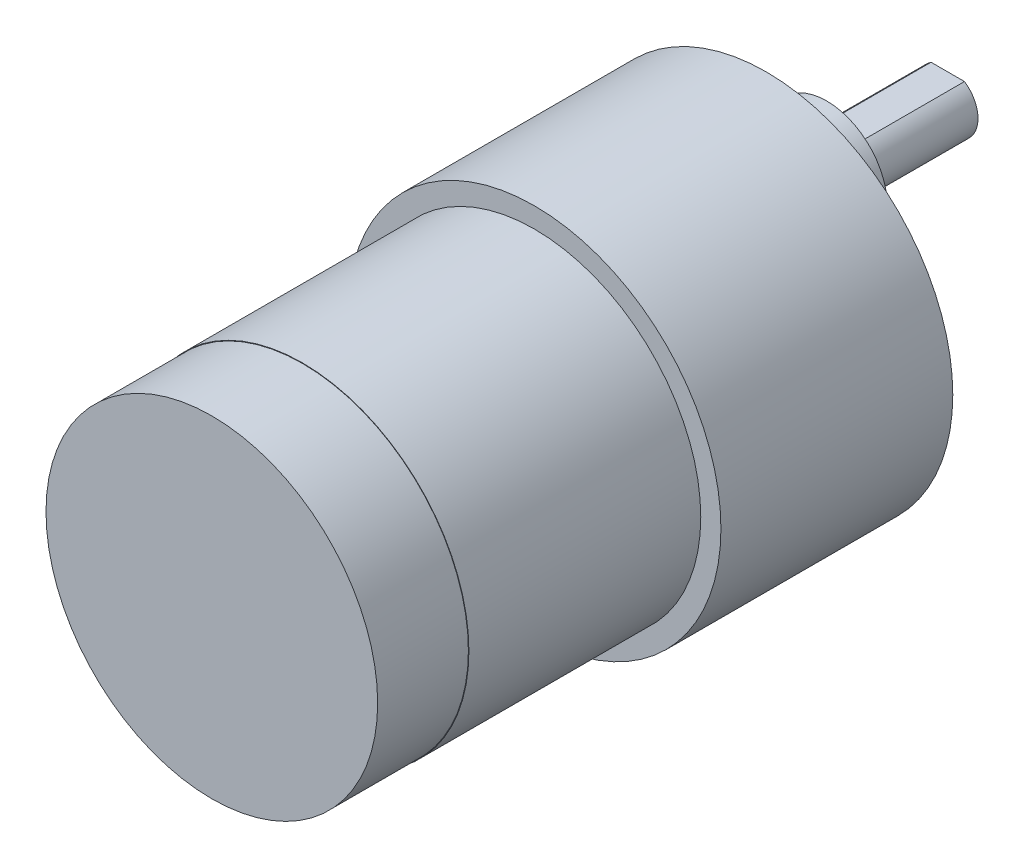
ISO-10303-21;
HEADER;
FILE_DESCRIPTION(('STEP AP214'),'2;1');
FILE_NAME('part.step','',(''),(''),'','','');
FILE_SCHEMA(('AUTOMOTIVE_DESIGN { 1 0 10303 214 1 1 1 1 }'));
ENDSEC;
DATA;
#1=APPLICATION_CONTEXT('core data for automotive mechanical design processes');
#2=APPLICATION_PROTOCOL_DEFINITION('international standard','automotive_design',2000,#1);
#3=PRODUCT_CONTEXT('',#1,'mechanical');
#4=PRODUCT('Part','Part','',(#3));
#5=PRODUCT_RELATED_PRODUCT_CATEGORY('part','',(#4));
#6=PRODUCT_DEFINITION_FORMATION('','',#4);
#7=PRODUCT_DEFINITION_CONTEXT('part definition',#1,'design');
#8=PRODUCT_DEFINITION('design','',#6,#7);
#9=PRODUCT_DEFINITION_SHAPE('','',#8);
#10=(LENGTH_UNIT() NAMED_UNIT(*) SI_UNIT(.MILLI.,.METRE.));
#11=(NAMED_UNIT(*) PLANE_ANGLE_UNIT() SI_UNIT($,.RADIAN.));
#12=(NAMED_UNIT(*) SI_UNIT($,.STERADIAN.) SOLID_ANGLE_UNIT());
#13=UNCERTAINTY_MEASURE_WITH_UNIT(LENGTH_MEASURE(1.E-05),#10,'distance_accuracy_value','');
#14=(GEOMETRIC_REPRESENTATION_CONTEXT(3) GLOBAL_UNCERTAINTY_ASSIGNED_CONTEXT((#13)) GLOBAL_UNIT_ASSIGNED_CONTEXT((#10,
#11,#12)) REPRESENTATION_CONTEXT('',''));
#15=CARTESIAN_POINT('',(0.,0.,0.));
#16=DIRECTION('',(0.,0.,1.));
#17=DIRECTION('',(1.,0.,0.));
#18=AXIS2_PLACEMENT_3D('',#15,#16,#17);
#19=CARTESIAN_POINT('',(0.,7.,-18.));
#20=DIRECTION('',(0.,0.,1.));
#21=DIRECTION('',(1.,0.,0.));
#22=AXIS2_PLACEMENT_3D('',#19,#20,#21);
#23=CYLINDRICAL_SURFACE('',#22,3.);
#24=CARTESIAN_POINT('',(0.,7.,-6.));
#25=DIRECTION('',(0.,0.,-1.));
#26=DIRECTION('',(-1.,0.,0.));
#27=AXIS2_PLACEMENT_3D('',#24,#25,#26);
#28=CIRCLE('',#27,3.);
#29=CARTESIAN_POINT('',(-3.,7.,-6.));
#30=VERTEX_POINT('',#29);
#31=EDGE_CURVE('E148',#30,#30,#28,.T.);
#32=ORIENTED_EDGE('',*,*,#31,.T.);
#33=EDGE_LOOP('',(#32));
#34=FACE_BOUND('',#33,.T.);
#35=DIRECTION('',(0.,0.,1.));
#36=VECTOR('',#35,1.);
#37=CARTESIAN_POINT('',(-1.6583123951777,9.5,-18.));
#38=LINE('',#37,#36);
#39=CARTESIAN_POINT('',(-1.6583123951777,9.5,-18.));
#40=VERTEX_POINT('',#39);
#41=CARTESIAN_POINT('',(-1.6583123951777,9.5,-6.5));
#42=VERTEX_POINT('',#41);
#43=EDGE_CURVE('E142',#40,#42,#38,.T.);
#44=ORIENTED_EDGE('',*,*,#43,.F.);
#45=CARTESIAN_POINT('',(0.,7.,-18.));
#46=DIRECTION('',(0.,0.,-1.));
#47=DIRECTION('',(-1.,0.,0.));
#48=AXIS2_PLACEMENT_3D('',#45,#46,#47);
#49=CIRCLE('',#48,3.);
#50=CARTESIAN_POINT('',(1.6583123951777,9.5,-18.));
#51=VERTEX_POINT('',#50);
#52=EDGE_CURVE('E144',#51,#40,#49,.T.);
#53=ORIENTED_EDGE('',*,*,#52,.F.);
#54=DIRECTION('',(0.,0.,1.));
#55=VECTOR('',#54,1.);
#56=CARTESIAN_POINT('',(1.6583123951777,9.5,-18.));
#57=LINE('',#56,#55);
#58=CARTESIAN_POINT('',(1.6583123951777,9.5,-6.5));
#59=VERTEX_POINT('',#58);
#60=EDGE_CURVE('E63',#59,#51,#57,.F.);
#61=ORIENTED_EDGE('',*,*,#60,.F.);
#62=CARTESIAN_POINT('',(0.,7.,-6.5));
#63=DIRECTION('',(0.,0.,-1.));
#64=DIRECTION('',(-1.,0.,0.));
#65=AXIS2_PLACEMENT_3D('',#62,#63,#64);
#66=CIRCLE('',#65,3.);
#67=EDGE_CURVE('E51',#42,#59,#66,.T.);
#68=ORIENTED_EDGE('',*,*,#67,.F.);
#69=EDGE_LOOP('',(#44,#53,#61,#68));
#70=FACE_BOUND('',#69,.T.);
#71=ADVANCED_FACE('F47',(#34,#70),#23,.T.);
#72=CARTESIAN_POINT('',(0.,7.,-18.));
#73=DIRECTION('',(0.,0.,-1.));
#74=DIRECTION('',(-1.,0.,0.));
#75=AXIS2_PLACEMENT_3D('',#72,#73,#74);
#76=PLANE('',#75);
#77=ORIENTED_EDGE('',*,*,#52,.T.);
#78=DIRECTION('',(1.,0.,0.));
#79=VECTOR('',#78,1.);
#80=CARTESIAN_POINT('',(0.,9.5,-18.));
#81=LINE('',#80,#79);
#82=EDGE_CURVE('E151',#40,#51,#81,.T.);
#83=ORIENTED_EDGE('',*,*,#82,.T.);
#84=EDGE_LOOP('',(#77,#83));
#85=FACE_BOUND('',#84,.T.);
#86=ADVANCED_FACE('F170',(#85),#76,.T.);
#87=CARTESIAN_POINT('',(0.,0.,23.));
#88=DIRECTION('',(0.,0.,-1.));
#89=DIRECTION('',(-1.,0.,0.));
#90=AXIS2_PLACEMENT_3D('',#87,#88,#89);
#91=CYLINDRICAL_SURFACE('',#90,18.5);
#92=CARTESIAN_POINT('',(0.,0.,23.));
#93=DIRECTION('',(0.,0.,1.));
#94=DIRECTION('',(1.,0.,0.));
#95=AXIS2_PLACEMENT_3D('',#92,#93,#94);
#96=CIRCLE('',#95,18.5);
#97=CARTESIAN_POINT('',(18.5,0.,23.));
#98=VERTEX_POINT('',#97);
#99=EDGE_CURVE('E162',#98,#98,#96,.T.);
#100=ORIENTED_EDGE('',*,*,#99,.F.);
#101=EDGE_LOOP('',(#100));
#102=FACE_BOUND('',#101,.T.);
#103=CARTESIAN_POINT('',(0.,0.,0.));
#104=DIRECTION('',(0.,0.,1.));
#105=DIRECTION('',(1.,0.,0.));
#106=AXIS2_PLACEMENT_3D('',#103,#104,#105);
#107=CIRCLE('',#106,18.5);
#108=CARTESIAN_POINT('',(18.5,0.,0.));
#109=VERTEX_POINT('',#108);
#110=EDGE_CURVE('E158',#109,#109,#107,.T.);
#111=ORIENTED_EDGE('',*,*,#110,.T.);
#112=EDGE_LOOP('',(#111));
#113=FACE_BOUND('',#112,.T.);
#114=ADVANCED_FACE('F49',(#102,#113),#91,.T.);
#115=CARTESIAN_POINT('',(0.,0.,23.));
#116=DIRECTION('',(0.,0.,1.));
#117=DIRECTION('',(1.,0.,0.));
#118=AXIS2_PLACEMENT_3D('',#115,#116,#117);
#119=PLANE('',#118);
#120=CARTESIAN_POINT('',(0.,0.,23.));
#121=DIRECTION('',(0.,0.,1.));
#122=DIRECTION('',(1.,0.,0.));
#123=AXIS2_PLACEMENT_3D('',#120,#121,#122);
#124=CIRCLE('',#123,16.5);
#125=CARTESIAN_POINT('',(16.5,0.,23.));
#126=VERTEX_POINT('',#125);
#127=EDGE_CURVE('E159',#126,#126,#124,.T.);
#128=ORIENTED_EDGE('',*,*,#127,.F.);
#129=EDGE_LOOP('',(#128));
#130=FACE_BOUND('',#129,.T.);
#131=ORIENTED_EDGE('',*,*,#99,.T.);
#132=EDGE_LOOP('',(#131));
#133=FACE_BOUND('',#132,.T.);
#134=ADVANCED_FACE('F207',(#130,#133),#119,.T.);
#135=CARTESIAN_POINT('',(0.,0.,0.));
#136=DIRECTION('',(0.,0.,1.));
#137=DIRECTION('',(1.,0.,0.));
#138=AXIS2_PLACEMENT_3D('',#135,#136,#137);
#139=PLANE('',#138);
#140=CARTESIAN_POINT('',(7.75000000000016,-13.4233937586587,0.));
#141=DIRECTION('',(0.,0.,-1.));
#142=DIRECTION('',(-1.,0.,0.));
#143=AXIS2_PLACEMENT_3D('',#140,#141,#142);
#144=CIRCLE('',#143,1.24999999999999);
#145=CARTESIAN_POINT('',(6.50000000000017,-13.4233937586587,0.));
#146=VERTEX_POINT('',#145);
#147=EDGE_CURVE('E104',#146,#146,#144,.T.);
#148=ORIENTED_EDGE('',*,*,#147,.F.);
#149=EDGE_LOOP('',(#148));
#150=FACE_BOUND('',#149,.T.);
#151=CARTESIAN_POINT('',(-7.74999999999987,-13.4233937586589,0.));
#152=DIRECTION('',(0.,0.,-1.));
#153=DIRECTION('',(-1.,0.,0.));
#154=AXIS2_PLACEMENT_3D('',#151,#152,#153);
#155=CIRCLE('',#154,1.24999999999999);
#156=CARTESIAN_POINT('',(-8.99999999999986,-13.4233937586589,0.));
#157=VERTEX_POINT('',#156);
#158=EDGE_CURVE('E103',#157,#157,#155,.T.);
#159=ORIENTED_EDGE('',*,*,#158,.F.);
#160=EDGE_LOOP('',(#159));
#161=FACE_BOUND('',#160,.T.);
#162=CARTESIAN_POINT('',(-15.5,0.,0.));
#163=DIRECTION('',(0.,0.,-1.));
#164=DIRECTION('',(-1.,0.,0.));
#165=AXIS2_PLACEMENT_3D('',#162,#163,#164);
#166=CIRCLE('',#165,1.24999999999999);
#167=CARTESIAN_POINT('',(-16.75,0.,0.));
#168=VERTEX_POINT('',#167);
#169=EDGE_CURVE('E115',#168,#168,#166,.T.);
#170=ORIENTED_EDGE('',*,*,#169,.F.);
#171=EDGE_LOOP('',(#170));
#172=FACE_BOUND('',#171,.T.);
#173=CARTESIAN_POINT('',(-7.75000000000006,13.4233937586588,0.));
#174=DIRECTION('',(0.,0.,-1.));
#175=DIRECTION('',(-1.,0.,0.));
#176=AXIS2_PLACEMENT_3D('',#173,#174,#175);
#177=CIRCLE('',#176,1.24999999999999);
#178=CARTESIAN_POINT('',(-9.00000000000005,13.4233937586588,0.));
#179=VERTEX_POINT('',#178);
#180=EDGE_CURVE('E121',#179,#179,#177,.T.);
#181=ORIENTED_EDGE('',*,*,#180,.F.);
#182=EDGE_LOOP('',(#181));
#183=FACE_BOUND('',#182,.T.);
#184=CARTESIAN_POINT('',(7.74999999999997,13.4233937586588,0.));
#185=DIRECTION('',(0.,0.,-1.));
#186=DIRECTION('',(-1.,0.,0.));
#187=AXIS2_PLACEMENT_3D('',#184,#185,#186);
#188=CIRCLE('',#187,1.24999999999999);
#189=CARTESIAN_POINT('',(6.49999999999998,13.4233937586588,0.));
#190=VERTEX_POINT('',#189);
#191=EDGE_CURVE('E127',#190,#190,#188,.T.);
#192=ORIENTED_EDGE('',*,*,#191,.F.);
#193=EDGE_LOOP('',(#192));
#194=FACE_BOUND('',#193,.T.);
#195=CARTESIAN_POINT('',(15.5,0.,0.));
#196=DIRECTION('',(0.,0.,-1.));
#197=DIRECTION('',(-1.,0.,0.));
#198=AXIS2_PLACEMENT_3D('',#195,#196,#197);
#199=CIRCLE('',#198,1.24999999999999);
#200=CARTESIAN_POINT('',(14.25,0.,0.));
#201=VERTEX_POINT('',#200);
#202=EDGE_CURVE('E133',#201,#201,#199,.T.);
#203=ORIENTED_EDGE('',*,*,#202,.F.);
#204=EDGE_LOOP('',(#203));
#205=FACE_BOUND('',#204,.T.);
#206=CARTESIAN_POINT('',(0.,7.,0.));
#207=DIRECTION('',(0.,0.,1.));
#208=DIRECTION('',(1.,0.,0.));
#209=AXIS2_PLACEMENT_3D('',#206,#207,#208);
#210=CIRCLE('',#209,6.);
#211=CARTESIAN_POINT('',(6.,7.,0.));
#212=VERTEX_POINT('',#211);
#213=EDGE_CURVE('E152',#212,#212,#210,.F.);
#214=ORIENTED_EDGE('',*,*,#213,.F.);
#215=EDGE_LOOP('',(#214));
#216=FACE_BOUND('',#215,.T.);
#217=ORIENTED_EDGE('',*,*,#110,.F.);
#218=EDGE_LOOP('',(#217));
#219=FACE_BOUND('',#218,.T.);
#220=ADVANCED_FACE('F205',(#150,#161,#172,#183,#194,#205,#216,#219),#139,.F.);
#221=CARTESIAN_POINT('',(0.,0.,46.));
#222=DIRECTION('',(0.,0.,-1.));
#223=DIRECTION('',(-1.,0.,0.));
#224=AXIS2_PLACEMENT_3D('',#221,#222,#223);
#225=CYLINDRICAL_SURFACE('',#224,16.5);
#226=CARTESIAN_POINT('',(0.,0.,46.));
#227=DIRECTION('',(0.,0.,1.));
#228=DIRECTION('',(1.,0.,0.));
#229=AXIS2_PLACEMENT_3D('',#226,#227,#228);
#230=CIRCLE('',#229,16.5);
#231=CARTESIAN_POINT('',(16.5,0.,46.));
#232=VERTEX_POINT('',#231);
#233=EDGE_CURVE('E155',#232,#232,#230,.T.);
#234=ORIENTED_EDGE('',*,*,#233,.F.);
#235=EDGE_LOOP('',(#234));
#236=FACE_BOUND('',#235,.T.);
#237=ORIENTED_EDGE('',*,*,#127,.T.);
#238=EDGE_LOOP('',(#237));
#239=FACE_BOUND('',#238,.T.);
#240=ADVANCED_FACE('F201',(#236,#239),#225,.T.);
#241=CARTESIAN_POINT('',(0.,0.,46.));
#242=DIRECTION('',(0.,0.,1.));
#243=DIRECTION('',(1.,0.,0.));
#244=AXIS2_PLACEMENT_3D('',#241,#242,#243);
#245=PLANE('',#244);
#246=CARTESIAN_POINT('',(0.,0.,46.));
#247=DIRECTION('',(0.,0.,1.));
#248=DIRECTION('',(1.,0.,0.));
#249=AXIS2_PLACEMENT_3D('',#246,#247,#248);
#250=CIRCLE('',#249,16.45);
#251=CARTESIAN_POINT('',(16.45,0.,46.));
#252=VERTEX_POINT('',#251);
#253=EDGE_CURVE('E11',#252,#252,#250,.T.);
#254=ORIENTED_EDGE('',*,*,#253,.F.);
#255=EDGE_LOOP('',(#254));
#256=FACE_BOUND('',#255,.T.);
#257=ORIENTED_EDGE('',*,*,#233,.T.);
#258=EDGE_LOOP('',(#257));
#259=FACE_BOUND('',#258,.T.);
#260=ADVANCED_FACE('F197',(#256,#259),#245,.T.);
#261=CARTESIAN_POINT('',(0.,7.,-6.));
#262=DIRECTION('',(0.,0.,1.));
#263=DIRECTION('',(1.,0.,0.));
#264=AXIS2_PLACEMENT_3D('',#261,#262,#263);
#265=CYLINDRICAL_SURFACE('',#264,6.);
#266=CARTESIAN_POINT('',(0.,7.,-6.));
#267=DIRECTION('',(0.,0.,-1.));
#268=DIRECTION('',(-1.,0.,0.));
#269=AXIS2_PLACEMENT_3D('',#266,#267,#268);
#270=CIRCLE('',#269,6.);
#271=CARTESIAN_POINT('',(-6.,7.,-6.));
#272=VERTEX_POINT('',#271);
#273=EDGE_CURVE('E147',#272,#272,#270,.T.);
#274=ORIENTED_EDGE('',*,*,#273,.F.);
#275=EDGE_LOOP('',(#274));
#276=FACE_BOUND('',#275,.T.);
#277=ORIENTED_EDGE('',*,*,#213,.T.);
#278=EDGE_LOOP('',(#277));
#279=FACE_BOUND('',#278,.T.);
#280=ADVANCED_FACE('F184',(#276,#279),#265,.T.);
#281=CARTESIAN_POINT('',(0.,7.,-6.));
#282=DIRECTION('',(0.,0.,-1.));
#283=DIRECTION('',(-1.,0.,0.));
#284=AXIS2_PLACEMENT_3D('',#281,#282,#283);
#285=PLANE('',#284);
#286=ORIENTED_EDGE('',*,*,#31,.F.);
#287=EDGE_LOOP('',(#286));
#288=FACE_BOUND('',#287,.T.);
#289=ORIENTED_EDGE('',*,*,#273,.T.);
#290=EDGE_LOOP('',(#289));
#291=FACE_BOUND('',#290,.T.);
#292=ADVANCED_FACE('F176',(#288,#291),#285,.T.);
#293=CARTESIAN_POINT('',(-3.,21.5,-6.5));
#294=DIRECTION('',(0.,0.,-1.));
#295=DIRECTION('',(-1.,0.,0.));
#296=AXIS2_PLACEMENT_3D('',#293,#294,#295);
#297=PLANE('',#296);
#298=ORIENTED_EDGE('',*,*,#67,.T.);
#299=DIRECTION('',(1.,0.,0.));
#300=VECTOR('',#299,1.);
#301=CARTESIAN_POINT('',(-3.,9.5,-6.5));
#302=LINE('',#301,#300);
#303=EDGE_CURVE('E139',#42,#59,#302,.T.);
#304=ORIENTED_EDGE('',*,*,#303,.F.);
#305=EDGE_LOOP('',(#298,#304));
#306=FACE_BOUND('',#305,.T.);
#307=ADVANCED_FACE('F174',(#306),#297,.T.);
#308=CARTESIAN_POINT('',(0.,9.5,0.));
#309=DIRECTION('',(0.,1.,0.));
#310=DIRECTION('',(0.,0.,1.));
#311=AXIS2_PLACEMENT_3D('',#308,#309,#310);
#312=PLANE('',#311);
#313=ORIENTED_EDGE('',*,*,#43,.T.);
#314=ORIENTED_EDGE('',*,*,#303,.T.);
#315=ORIENTED_EDGE('',*,*,#60,.T.);
#316=ORIENTED_EDGE('',*,*,#82,.F.);
#317=EDGE_LOOP('',(#313,#314,#315,#316));
#318=FACE_BOUND('',#317,.T.);
#319=ADVANCED_FACE('F173',(#318),#312,.T.);
#320=CARTESIAN_POINT('',(15.5,0.,5.));
#321=DIRECTION('',(0.,0.,-1.));
#322=DIRECTION('',(-1.,0.,0.));
#323=AXIS2_PLACEMENT_3D('',#320,#321,#322);
#324=CONICAL_SURFACE('',#323,1.25,1.02974425867665);
#325=CARTESIAN_POINT('',(15.5,0.,5.75107577378445));
#326=VERTEX_POINT('',#325);
#327=VERTEX_LOOP('',#326);
#328=FACE_BOUND('',#327,.T.);
#329=CARTESIAN_POINT('',(15.5,0.,5.));
#330=DIRECTION('',(0.,0.,-1.));
#331=DIRECTION('',(-1.,0.,0.));
#332=AXIS2_PLACEMENT_3D('',#329,#330,#331);
#333=CIRCLE('',#332,1.25);
#334=CARTESIAN_POINT('',(14.25,0.,5.));
#335=VERTEX_POINT('',#334);
#336=EDGE_CURVE('E136',#335,#335,#333,.T.);
#337=ORIENTED_EDGE('',*,*,#336,.T.);
#338=EDGE_LOOP('',(#337));
#339=FACE_BOUND('',#338,.T.);
#340=ADVANCED_FACE('F182',(#328,#339),#324,.F.);
#341=CARTESIAN_POINT('',(15.5,0.,0.));
#342=DIRECTION('',(0.,0.,-1.));
#343=DIRECTION('',(-1.,0.,0.));
#344=AXIS2_PLACEMENT_3D('',#341,#342,#343);
#345=CYLINDRICAL_SURFACE('',#344,1.24999999999999);
#346=ORIENTED_EDGE('',*,*,#336,.F.);
#347=EDGE_LOOP('',(#346));
#348=FACE_BOUND('',#347,.T.);
#349=ORIENTED_EDGE('',*,*,#202,.T.);
#350=EDGE_LOOP('',(#349));
#351=FACE_BOUND('',#350,.T.);
#352=ADVANCED_FACE('F289',(#348,#351),#345,.F.);
#353=CARTESIAN_POINT('',(7.74999999999997,13.4233937586588,5.));
#354=DIRECTION('',(0.,0.,-1.));
#355=DIRECTION('',(-1.,0.,0.));
#356=AXIS2_PLACEMENT_3D('',#353,#354,#355);
#357=CONICAL_SURFACE('',#356,1.25,1.02974425867665);
#358=CARTESIAN_POINT('',(7.74999999999997,13.4233937586588,5.75107577378445));
#359=VERTEX_POINT('',#358);
#360=VERTEX_LOOP('',#359);
#361=FACE_BOUND('',#360,.T.);
#362=CARTESIAN_POINT('',(7.74999999999997,13.4233937586588,5.));
#363=DIRECTION('',(0.,0.,-1.));
#364=DIRECTION('',(-1.,0.,0.));
#365=AXIS2_PLACEMENT_3D('',#362,#363,#364);
#366=CIRCLE('',#365,1.25);
#367=CARTESIAN_POINT('',(6.49999999999997,13.4233937586588,5.));
#368=VERTEX_POINT('',#367);
#369=EDGE_CURVE('E130',#368,#368,#366,.T.);
#370=ORIENTED_EDGE('',*,*,#369,.T.);
#371=EDGE_LOOP('',(#370));
#372=FACE_BOUND('',#371,.T.);
#373=ADVANCED_FACE('F299',(#361,#372),#357,.F.);
#374=CARTESIAN_POINT('',(7.74999999999997,13.4233937586588,0.));
#375=DIRECTION('',(0.,0.,-1.));
#376=DIRECTION('',(-1.,0.,0.));
#377=AXIS2_PLACEMENT_3D('',#374,#375,#376);
#378=CYLINDRICAL_SURFACE('',#377,1.24999999999999);
#379=ORIENTED_EDGE('',*,*,#369,.F.);
#380=EDGE_LOOP('',(#379));
#381=FACE_BOUND('',#380,.T.);
#382=ORIENTED_EDGE('',*,*,#191,.T.);
#383=EDGE_LOOP('',(#382));
#384=FACE_BOUND('',#383,.T.);
#385=ADVANCED_FACE('F315',(#381,#384),#378,.F.);
#386=CARTESIAN_POINT('',(-7.75000000000006,13.4233937586588,5.));
#387=DIRECTION('',(0.,0.,-1.));
#388=DIRECTION('',(-1.,0.,0.));
#389=AXIS2_PLACEMENT_3D('',#386,#387,#388);
#390=CONICAL_SURFACE('',#389,1.25,1.02974425867665);
#391=CARTESIAN_POINT('',(-7.75000000000006,13.4233937586588,5.75107577378445));
#392=VERTEX_POINT('',#391);
#393=VERTEX_LOOP('',#392);
#394=FACE_BOUND('',#393,.T.);
#395=CARTESIAN_POINT('',(-7.75000000000006,13.4233937586588,5.));
#396=DIRECTION('',(0.,0.,-1.));
#397=DIRECTION('',(-1.,0.,0.));
#398=AXIS2_PLACEMENT_3D('',#395,#396,#397);
#399=CIRCLE('',#398,1.25);
#400=CARTESIAN_POINT('',(-9.00000000000006,13.4233937586588,5.));
#401=VERTEX_POINT('',#400);
#402=EDGE_CURVE('E124',#401,#401,#399,.T.);
#403=ORIENTED_EDGE('',*,*,#402,.T.);
#404=EDGE_LOOP('',(#403));
#405=FACE_BOUND('',#404,.T.);
#406=ADVANCED_FACE('F326',(#394,#405),#390,.F.);
#407=CARTESIAN_POINT('',(-7.75000000000006,13.4233937586588,0.));
#408=DIRECTION('',(0.,0.,-1.));
#409=DIRECTION('',(-1.,0.,0.));
#410=AXIS2_PLACEMENT_3D('',#407,#408,#409);
#411=CYLINDRICAL_SURFACE('',#410,1.24999999999999);
#412=ORIENTED_EDGE('',*,*,#402,.F.);
#413=EDGE_LOOP('',(#412));
#414=FACE_BOUND('',#413,.T.);
#415=ORIENTED_EDGE('',*,*,#180,.T.);
#416=EDGE_LOOP('',(#415));
#417=FACE_BOUND('',#416,.T.);
#418=ADVANCED_FACE('F338',(#414,#417),#411,.F.);
#419=CARTESIAN_POINT('',(-15.5,0.,5.));
#420=DIRECTION('',(0.,0.,-1.));
#421=DIRECTION('',(-1.,0.,0.));
#422=AXIS2_PLACEMENT_3D('',#419,#420,#421);
#423=CONICAL_SURFACE('',#422,1.25,1.02974425867665);
#424=CARTESIAN_POINT('',(-15.5,0.,5.75107577378445));
#425=VERTEX_POINT('',#424);
#426=VERTEX_LOOP('',#425);
#427=FACE_BOUND('',#426,.T.);
#428=CARTESIAN_POINT('',(-15.5,0.,5.));
#429=DIRECTION('',(0.,0.,-1.));
#430=DIRECTION('',(-1.,0.,0.));
#431=AXIS2_PLACEMENT_3D('',#428,#429,#430);
#432=CIRCLE('',#431,1.25);
#433=CARTESIAN_POINT('',(-16.75,0.,5.));
#434=VERTEX_POINT('',#433);
#435=EDGE_CURVE('E118',#434,#434,#432,.T.);
#436=ORIENTED_EDGE('',*,*,#435,.T.);
#437=EDGE_LOOP('',(#436));
#438=FACE_BOUND('',#437,.T.);
#439=ADVANCED_FACE('F349',(#427,#438),#423,.F.);
#440=CARTESIAN_POINT('',(-15.5,0.,0.));
#441=DIRECTION('',(0.,0.,-1.));
#442=DIRECTION('',(-1.,0.,0.));
#443=AXIS2_PLACEMENT_3D('',#440,#441,#442);
#444=CYLINDRICAL_SURFACE('',#443,1.24999999999999);
#445=ORIENTED_EDGE('',*,*,#435,.F.);
#446=EDGE_LOOP('',(#445));
#447=FACE_BOUND('',#446,.T.);
#448=ORIENTED_EDGE('',*,*,#169,.T.);
#449=EDGE_LOOP('',(#448));
#450=FACE_BOUND('',#449,.T.);
#451=ADVANCED_FACE('F361',(#447,#450),#444,.F.);
#452=CARTESIAN_POINT('',(-7.74999999999987,-13.4233937586589,5.));
#453=DIRECTION('',(0.,0.,-1.));
#454=DIRECTION('',(-1.,0.,0.));
#455=AXIS2_PLACEMENT_3D('',#452,#453,#454);
#456=CONICAL_SURFACE('',#455,1.25,1.02974425867665);
#457=CARTESIAN_POINT('',(-7.74999999999988,-13.4233937586589,5.75107577378445));
#458=VERTEX_POINT('',#457);
#459=VERTEX_LOOP('',#458);
#460=FACE_BOUND('',#459,.T.);
#461=CARTESIAN_POINT('',(-7.74999999999987,-13.4233937586589,5.));
#462=DIRECTION('',(0.,0.,-1.));
#463=DIRECTION('',(-1.,0.,0.));
#464=AXIS2_PLACEMENT_3D('',#461,#462,#463);
#465=CIRCLE('',#464,1.25);
#466=CARTESIAN_POINT('',(-8.99999999999987,-13.4233937586589,5.));
#467=VERTEX_POINT('',#466);
#468=EDGE_CURVE('E107',#467,#467,#465,.T.);
#469=ORIENTED_EDGE('',*,*,#468,.T.);
#470=EDGE_LOOP('',(#469));
#471=FACE_BOUND('',#470,.T.);
#472=ADVANCED_FACE('F371',(#460,#471),#456,.F.);
#473=CARTESIAN_POINT('',(-7.74999999999987,-13.4233937586589,0.));
#474=DIRECTION('',(0.,0.,-1.));
#475=DIRECTION('',(-1.,0.,0.));
#476=AXIS2_PLACEMENT_3D('',#473,#474,#475);
#477=CYLINDRICAL_SURFACE('',#476,1.24999999999999);
#478=ORIENTED_EDGE('',*,*,#468,.F.);
#479=EDGE_LOOP('',(#478));
#480=FACE_BOUND('',#479,.T.);
#481=ORIENTED_EDGE('',*,*,#158,.T.);
#482=EDGE_LOOP('',(#481));
#483=FACE_BOUND('',#482,.T.);
#484=ADVANCED_FACE('F97',(#480,#483),#477,.F.);
#485=CARTESIAN_POINT('',(7.75000000000016,-13.4233937586587,5.));
#486=DIRECTION('',(0.,0.,-1.));
#487=DIRECTION('',(-1.,0.,0.));
#488=AXIS2_PLACEMENT_3D('',#485,#486,#487);
#489=CONICAL_SURFACE('',#488,1.25,1.02974425867665);
#490=CARTESIAN_POINT('',(7.75000000000016,-13.4233937586587,5.75107577378445));
#491=VERTEX_POINT('',#490);
#492=VERTEX_LOOP('',#491);
#493=FACE_BOUND('',#492,.T.);
#494=CARTESIAN_POINT('',(7.75000000000016,-13.4233937586587,5.));
#495=DIRECTION('',(0.,0.,-1.));
#496=DIRECTION('',(-1.,0.,0.));
#497=AXIS2_PLACEMENT_3D('',#494,#495,#496);
#498=CIRCLE('',#497,1.25);
#499=CARTESIAN_POINT('',(6.50000000000016,-13.4233937586587,5.));
#500=VERTEX_POINT('',#499);
#501=EDGE_CURVE('E101',#500,#500,#498,.T.);
#502=ORIENTED_EDGE('',*,*,#501,.T.);
#503=EDGE_LOOP('',(#502));
#504=FACE_BOUND('',#503,.T.);
#505=ADVANCED_FACE('F93',(#493,#504),#489,.F.);
#506=CARTESIAN_POINT('',(7.75000000000016,-13.4233937586587,0.));
#507=DIRECTION('',(0.,0.,-1.));
#508=DIRECTION('',(-1.,0.,0.));
#509=AXIS2_PLACEMENT_3D('',#506,#507,#508);
#510=CYLINDRICAL_SURFACE('',#509,1.24999999999999);
#511=ORIENTED_EDGE('',*,*,#501,.F.);
#512=EDGE_LOOP('',(#511));
#513=FACE_BOUND('',#512,.T.);
#514=ORIENTED_EDGE('',*,*,#147,.T.);
#515=EDGE_LOOP('',(#514));
#516=FACE_BOUND('',#515,.T.);
#517=ADVANCED_FACE('F96',(#513,#516),#510,.F.);
#518=CARTESIAN_POINT('',(0.,0.,55.));
#519=DIRECTION('',(0.,0.,-1.));
#520=DIRECTION('',(-1.,0.,0.));
#521=AXIS2_PLACEMENT_3D('',#518,#519,#520);
#522=CYLINDRICAL_SURFACE('',#521,16.45);
#523=CARTESIAN_POINT('',(0.,0.,55.));
#524=DIRECTION('',(0.,0.,1.));
#525=DIRECTION('',(1.,0.,0.));
#526=AXIS2_PLACEMENT_3D('',#523,#524,#525);
#527=CIRCLE('',#526,16.45);
#528=CARTESIAN_POINT('',(16.45,0.,55.));
#529=VERTEX_POINT('',#528);
#530=EDGE_CURVE('E110',#529,#529,#527,.T.);
#531=ORIENTED_EDGE('',*,*,#530,.F.);
#532=EDGE_LOOP('',(#531));
#533=FACE_BOUND('',#532,.T.);
#534=ORIENTED_EDGE('',*,*,#253,.T.);
#535=EDGE_LOOP('',(#534));
#536=FACE_BOUND('',#535,.T.);
#537=ADVANCED_FACE('F408',(#533,#536),#522,.T.);
#538=CARTESIAN_POINT('',(0.,0.,55.));
#539=DIRECTION('',(0.,0.,1.));
#540=DIRECTION('',(1.,0.,0.));
#541=AXIS2_PLACEMENT_3D('',#538,#539,#540);
#542=PLANE('',#541);
#543=ORIENTED_EDGE('',*,*,#530,.T.);
#544=EDGE_LOOP('',(#543));
#545=FACE_BOUND('',#544,.T.);
#546=ADVANCED_FACE('F423',(#545),#542,.T.);
#547=CLOSED_SHELL('',(#71,#86,#114,#134,#220,#240,#260,#280,#292,#307,#319,#340,#352,#373,#385,
#406,#418,#439,#451,#472,#484,#505,#517,#537,#546));
#548=MANIFOLD_SOLID_BREP('B2',#547);
#549=ADVANCED_BREP_SHAPE_REPRESENTATION('',(#18,#548),#14);
#550=SHAPE_DEFINITION_REPRESENTATION(#9,#549);
ENDSEC;
END-ISO-10303-21;
